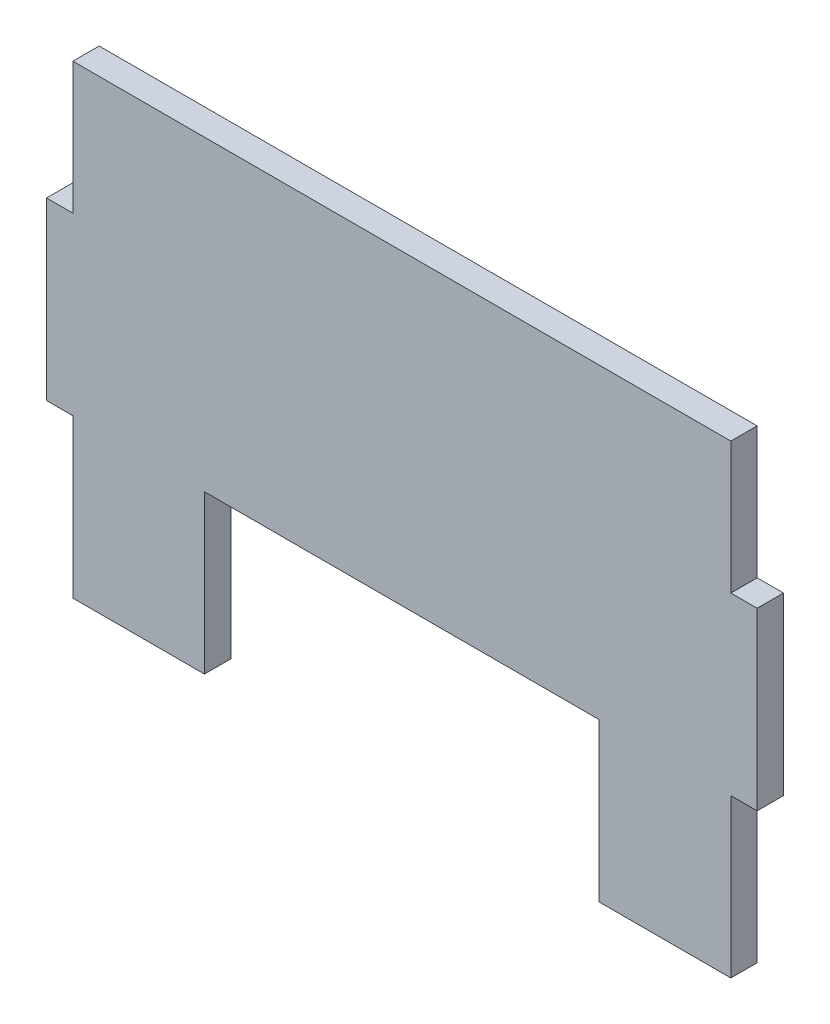
ISO-10303-21;
HEADER;
FILE_DESCRIPTION(('STEP AP214'),'2;1');
FILE_NAME('part.step','',(''),(''),'','','');
FILE_SCHEMA(('AUTOMOTIVE_DESIGN { 1 0 10303 214 1 1 1 1 }'));
ENDSEC;
DATA;
#1=APPLICATION_CONTEXT('core data for automotive mechanical design processes');
#2=APPLICATION_PROTOCOL_DEFINITION('international standard','automotive_design',2000,#1);
#3=PRODUCT_CONTEXT('',#1,'mechanical');
#4=PRODUCT('Part','Part','',(#3));
#5=PRODUCT_RELATED_PRODUCT_CATEGORY('part','',(#4));
#6=PRODUCT_DEFINITION_FORMATION('','',#4);
#7=PRODUCT_DEFINITION_CONTEXT('part definition',#1,'design');
#8=PRODUCT_DEFINITION('design','',#6,#7);
#9=PRODUCT_DEFINITION_SHAPE('','',#8);
#10=(LENGTH_UNIT() NAMED_UNIT(*) SI_UNIT(.MILLI.,.METRE.));
#11=(NAMED_UNIT(*) PLANE_ANGLE_UNIT() SI_UNIT($,.RADIAN.));
#12=(NAMED_UNIT(*) SI_UNIT($,.STERADIAN.) SOLID_ANGLE_UNIT());
#13=UNCERTAINTY_MEASURE_WITH_UNIT(LENGTH_MEASURE(1.E-05),#10,'distance_accuracy_value','');
#14=(GEOMETRIC_REPRESENTATION_CONTEXT(3) GLOBAL_UNCERTAINTY_ASSIGNED_CONTEXT((#13)) GLOBAL_UNIT_ASSIGNED_CONTEXT((#10,
#11,#12)) REPRESENTATION_CONTEXT('',''));
#15=CARTESIAN_POINT('',(0.,0.,0.));
#16=DIRECTION('',(0.,0.,1.));
#17=DIRECTION('',(1.,0.,0.));
#18=AXIS2_PLACEMENT_3D('',#15,#16,#17);
#19=CARTESIAN_POINT('',(-75.,-50.,6.));
#20=DIRECTION('',(1.,0.,0.));
#21=DIRECTION('',(0.,0.,-1.));
#22=AXIS2_PLACEMENT_3D('',#19,#20,#21);
#23=PLANE('',#22);
#24=DIRECTION('',(0.,0.,-1.));
#25=VECTOR('',#24,1.);
#26=CARTESIAN_POINT('',(-75.,20.,0.));
#27=LINE('',#26,#25);
#28=CARTESIAN_POINT('',(-75.,20.,6.));
#29=VERTEX_POINT('',#28);
#30=CARTESIAN_POINT('',(-75.,20.,0.));
#31=VERTEX_POINT('',#30);
#32=EDGE_CURVE('E51',#29,#31,#27,.T.);
#33=ORIENTED_EDGE('',*,*,#32,.F.);
#34=DIRECTION('',(0.,-1.,0.));
#35=VECTOR('',#34,1.);
#36=CARTESIAN_POINT('',(-75.,-50.,6.));
#37=LINE('',#36,#35);
#38=CARTESIAN_POINT('',(-75.,50.,6.));
#39=VERTEX_POINT('',#38);
#40=EDGE_CURVE('E256',#39,#29,#37,.T.);
#41=ORIENTED_EDGE('',*,*,#40,.F.);
#42=DIRECTION('',(0.,0.,-1.));
#43=VECTOR('',#42,1.);
#44=CARTESIAN_POINT('',(-75.,50.,6.));
#45=LINE('',#44,#43);
#46=CARTESIAN_POINT('',(-75.,50.,0.));
#47=VERTEX_POINT('',#46);
#48=EDGE_CURVE('E44',#39,#47,#45,.T.);
#49=ORIENTED_EDGE('',*,*,#48,.T.);
#50=DIRECTION('',(0.,-1.,0.));
#51=VECTOR('',#50,1.);
#52=CARTESIAN_POINT('',(-75.,-50.,0.));
#53=LINE('',#52,#51);
#54=EDGE_CURVE('E264',#47,#31,#53,.T.);
#55=ORIENTED_EDGE('',*,*,#54,.T.);
#56=EDGE_LOOP('',(#33,#41,#49,#55));
#57=FACE_BOUND('',#56,.T.);
#58=ADVANCED_FACE('F37',(#57),#23,.F.);
#59=DIRECTION('',(0.,0.,1.));
#60=VECTOR('',#59,1.);
#61=CARTESIAN_POINT('',(-75.,-20.,0.));
#62=LINE('',#61,#60);
#63=CARTESIAN_POINT('',(-75.,-20.,0.));
#64=VERTEX_POINT('',#63);
#65=CARTESIAN_POINT('',(-75.,-20.,6.));
#66=VERTEX_POINT('',#65);
#67=EDGE_CURVE('E59',#64,#66,#62,.T.);
#68=ORIENTED_EDGE('',*,*,#67,.F.);
#69=CARTESIAN_POINT('',(-75.,-56.,0.));
#70=VERTEX_POINT('',#69);
#71=EDGE_CURVE('E255',#64,#70,#53,.T.);
#72=ORIENTED_EDGE('',*,*,#71,.T.);
#73=DIRECTION('',(0.,0.,-1.));
#74=VECTOR('',#73,1.);
#75=CARTESIAN_POINT('',(-75.,-56.,6.));
#76=LINE('',#75,#74);
#77=CARTESIAN_POINT('',(-75.,-56.,6.));
#78=VERTEX_POINT('',#77);
#79=EDGE_CURVE('E171',#78,#70,#76,.T.);
#80=ORIENTED_EDGE('',*,*,#79,.F.);
#81=EDGE_CURVE('E167',#66,#78,#37,.T.);
#82=ORIENTED_EDGE('',*,*,#81,.F.);
#83=EDGE_LOOP('',(#68,#72,#80,#82));
#84=FACE_BOUND('',#83,.T.);
#85=ADVANCED_FACE('F328',(#84),#23,.F.);
#86=CARTESIAN_POINT('',(75.,-50.,6.));
#87=DIRECTION('',(-1.,0.,0.));
#88=DIRECTION('',(0.,0.,1.));
#89=AXIS2_PLACEMENT_3D('',#86,#87,#88);
#90=PLANE('',#89);
#91=DIRECTION('',(0.,0.,-1.));
#92=VECTOR('',#91,1.);
#93=CARTESIAN_POINT('',(75.,-20.,0.));
#94=LINE('',#93,#92);
#95=CARTESIAN_POINT('',(75.,-20.,6.));
#96=VERTEX_POINT('',#95);
#97=CARTESIAN_POINT('',(75.,-20.,0.));
#98=VERTEX_POINT('',#97);
#99=EDGE_CURVE('E220',#96,#98,#94,.T.);
#100=ORIENTED_EDGE('',*,*,#99,.F.);
#101=DIRECTION('',(0.,1.,0.));
#102=VECTOR('',#101,1.);
#103=CARTESIAN_POINT('',(75.,-50.,6.));
#104=LINE('',#103,#102);
#105=CARTESIAN_POINT('',(75.,-56.,6.));
#106=VERTEX_POINT('',#105);
#107=EDGE_CURVE('E259',#106,#96,#104,.T.);
#108=ORIENTED_EDGE('',*,*,#107,.F.);
#109=DIRECTION('',(0.,0.,1.));
#110=VECTOR('',#109,1.);
#111=CARTESIAN_POINT('',(75.,-56.,6.));
#112=LINE('',#111,#110);
#113=CARTESIAN_POINT('',(75.,-56.,0.));
#114=VERTEX_POINT('',#113);
#115=EDGE_CURVE('E181',#114,#106,#112,.T.);
#116=ORIENTED_EDGE('',*,*,#115,.F.);
#117=DIRECTION('',(0.,1.,0.));
#118=VECTOR('',#117,1.);
#119=CARTESIAN_POINT('',(75.,-50.,0.));
#120=LINE('',#119,#118);
#121=EDGE_CURVE('E267',#114,#98,#120,.T.);
#122=ORIENTED_EDGE('',*,*,#121,.T.);
#123=EDGE_LOOP('',(#100,#108,#116,#122));
#124=FACE_BOUND('',#123,.T.);
#125=ADVANCED_FACE('F306',(#124),#90,.F.);
#126=DIRECTION('',(0.,0.,1.));
#127=VECTOR('',#126,1.);
#128=CARTESIAN_POINT('',(75.,20.,0.));
#129=LINE('',#128,#127);
#130=CARTESIAN_POINT('',(75.,20.,0.));
#131=VERTEX_POINT('',#130);
#132=CARTESIAN_POINT('',(75.,20.,6.));
#133=VERTEX_POINT('',#132);
#134=EDGE_CURVE('E215',#131,#133,#129,.T.);
#135=ORIENTED_EDGE('',*,*,#134,.F.);
#136=CARTESIAN_POINT('',(75.,50.,0.));
#137=VERTEX_POINT('',#136);
#138=EDGE_CURVE('E266',#131,#137,#120,.T.);
#139=ORIENTED_EDGE('',*,*,#138,.T.);
#140=DIRECTION('',(0.,0.,-1.));
#141=VECTOR('',#140,1.);
#142=CARTESIAN_POINT('',(75.,50.,6.));
#143=LINE('',#142,#141);
#144=CARTESIAN_POINT('',(75.,50.,6.));
#145=VERTEX_POINT('',#144);
#146=EDGE_CURVE('E11',#145,#137,#143,.T.);
#147=ORIENTED_EDGE('',*,*,#146,.F.);
#148=EDGE_CURVE('E258',#133,#145,#104,.T.);
#149=ORIENTED_EDGE('',*,*,#148,.F.);
#150=EDGE_LOOP('',(#135,#139,#147,#149));
#151=FACE_BOUND('',#150,.T.);
#152=ADVANCED_FACE('F290',(#151),#90,.F.);
#153=CARTESIAN_POINT('',(75.,50.,6.));
#154=DIRECTION('',(0.,-1.,0.));
#155=DIRECTION('',(1.,0.,0.));
#156=AXIS2_PLACEMENT_3D('',#153,#154,#155);
#157=PLANE('',#156);
#158=DIRECTION('',(-1.,0.,0.));
#159=VECTOR('',#158,1.);
#160=CARTESIAN_POINT('',(75.,50.,0.));
#161=LINE('',#160,#159);
#162=EDGE_CURVE('E269',#137,#47,#161,.T.);
#163=ORIENTED_EDGE('',*,*,#162,.T.);
#164=ORIENTED_EDGE('',*,*,#48,.F.);
#165=DIRECTION('',(-1.,0.,0.));
#166=VECTOR('',#165,1.);
#167=CARTESIAN_POINT('',(75.,50.,6.));
#168=LINE('',#167,#166);
#169=EDGE_CURVE('E262',#145,#39,#168,.T.);
#170=ORIENTED_EDGE('',*,*,#169,.F.);
#171=ORIENTED_EDGE('',*,*,#146,.T.);
#172=EDGE_LOOP('',(#163,#164,#170,#171));
#173=FACE_BOUND('',#172,.T.);
#174=ADVANCED_FACE('F288',(#173),#157,.F.);
#175=CARTESIAN_POINT('',(0.,0.,6.));
#176=DIRECTION('',(0.,0.,1.));
#177=DIRECTION('',(1.,0.,0.));
#178=AXIS2_PLACEMENT_3D('',#175,#176,#177);
#179=PLANE('',#178);
#180=DIRECTION('',(0.,1.,0.));
#181=VECTOR('',#180,1.);
#182=CARTESIAN_POINT('',(45.,-50.,6.));
#183=LINE('',#182,#181);
#184=CARTESIAN_POINT('',(45.,-56.,6.));
#185=VERTEX_POINT('',#184);
#186=CARTESIAN_POINT('',(45.,-20.,6.));
#187=VERTEX_POINT('',#186);
#188=EDGE_CURVE('E161',#185,#187,#183,.T.);
#189=ORIENTED_EDGE('',*,*,#188,.F.);
#190=DIRECTION('',(-1.,0.,0.));
#191=VECTOR('',#190,1.);
#192=CARTESIAN_POINT('',(75.,-56.,6.));
#193=LINE('',#192,#191);
#194=EDGE_CURVE('E184',#106,#185,#193,.T.);
#195=ORIENTED_EDGE('',*,*,#194,.F.);
#196=ORIENTED_EDGE('',*,*,#107,.T.);
#197=DIRECTION('',(-1.,0.,0.));
#198=VECTOR('',#197,1.);
#199=CARTESIAN_POINT('',(81.,-20.,6.));
#200=LINE('',#199,#198);
#201=CARTESIAN_POINT('',(81.,-20.,6.));
#202=VERTEX_POINT('',#201);
#203=EDGE_CURVE('E233',#202,#96,#200,.T.);
#204=ORIENTED_EDGE('',*,*,#203,.F.);
#205=DIRECTION('',(0.,-1.,0.));
#206=VECTOR('',#205,1.);
#207=CARTESIAN_POINT('',(81.,20.,6.));
#208=LINE('',#207,#206);
#209=CARTESIAN_POINT('',(81.,20.,6.));
#210=VERTEX_POINT('',#209);
#211=EDGE_CURVE('E222',#210,#202,#208,.T.);
#212=ORIENTED_EDGE('',*,*,#211,.F.);
#213=DIRECTION('',(-1.,0.,0.));
#214=VECTOR('',#213,1.);
#215=CARTESIAN_POINT('',(81.,20.,6.));
#216=LINE('',#215,#214);
#217=EDGE_CURVE('E236',#210,#133,#216,.T.);
#218=ORIENTED_EDGE('',*,*,#217,.T.);
#219=ORIENTED_EDGE('',*,*,#148,.T.);
#220=ORIENTED_EDGE('',*,*,#169,.T.);
#221=ORIENTED_EDGE('',*,*,#40,.T.);
#222=DIRECTION('',(1.,0.,0.));
#223=VECTOR('',#222,1.);
#224=CARTESIAN_POINT('',(-81.,20.,6.));
#225=LINE('',#224,#223);
#226=CARTESIAN_POINT('',(-81.,20.,6.));
#227=VERTEX_POINT('',#226);
#228=EDGE_CURVE('E207',#227,#29,#225,.T.);
#229=ORIENTED_EDGE('',*,*,#228,.F.);
#230=DIRECTION('',(0.,1.,0.));
#231=VECTOR('',#230,1.);
#232=CARTESIAN_POINT('',(-81.,20.,6.));
#233=LINE('',#232,#231);
#234=CARTESIAN_POINT('',(-81.,-20.,6.));
#235=VERTEX_POINT('',#234);
#236=EDGE_CURVE('E198',#235,#227,#233,.T.);
#237=ORIENTED_EDGE('',*,*,#236,.F.);
#238=DIRECTION('',(1.,0.,0.));
#239=VECTOR('',#238,1.);
#240=CARTESIAN_POINT('',(-81.,-20.,6.));
#241=LINE('',#240,#239);
#242=EDGE_CURVE('E210',#235,#66,#241,.T.);
#243=ORIENTED_EDGE('',*,*,#242,.T.);
#244=ORIENTED_EDGE('',*,*,#81,.T.);
#245=DIRECTION('',(-1.,0.,0.));
#246=VECTOR('',#245,1.);
#247=CARTESIAN_POINT('',(-45.,-56.,6.));
#248=LINE('',#247,#246);
#249=CARTESIAN_POINT('',(-45.,-56.,6.));
#250=VERTEX_POINT('',#249);
#251=EDGE_CURVE('E164',#250,#78,#248,.T.);
#252=ORIENTED_EDGE('',*,*,#251,.F.);
#253=DIRECTION('',(0.,1.,0.));
#254=VECTOR('',#253,1.);
#255=CARTESIAN_POINT('',(-45.,-50.,6.));
#256=LINE('',#255,#254);
#257=CARTESIAN_POINT('',(-45.,-20.,6.));
#258=VERTEX_POINT('',#257);
#259=EDGE_CURVE('E150',#250,#258,#256,.T.);
#260=ORIENTED_EDGE('',*,*,#259,.T.);
#261=DIRECTION('',(1.,0.,0.));
#262=VECTOR('',#261,1.);
#263=CARTESIAN_POINT('',(-45.,-20.,6.));
#264=LINE('',#263,#262);
#265=EDGE_CURVE('E242',#258,#187,#264,.T.);
#266=ORIENTED_EDGE('',*,*,#265,.T.);
#267=EDGE_LOOP('',(#189,#195,#196,#204,#212,#218,#219,#220,#221,#229,#237,#243,#244,#252,#260,#266));
#268=FACE_BOUND('',#267,.T.);
#269=ADVANCED_FACE('F165',(#268),#179,.T.);
#270=CARTESIAN_POINT('',(0.,0.,0.));
#271=DIRECTION('',(0.,0.,1.));
#272=DIRECTION('',(1.,0.,0.));
#273=AXIS2_PLACEMENT_3D('',#270,#271,#272);
#274=PLANE('',#273);
#275=ORIENTED_EDGE('',*,*,#121,.F.);
#276=DIRECTION('',(1.,0.,0.));
#277=VECTOR('',#276,1.);
#278=CARTESIAN_POINT('',(75.,-56.,0.));
#279=LINE('',#278,#277);
#280=CARTESIAN_POINT('',(45.,-56.,0.));
#281=VERTEX_POINT('',#280);
#282=EDGE_CURVE('E190',#281,#114,#279,.T.);
#283=ORIENTED_EDGE('',*,*,#282,.F.);
#284=DIRECTION('',(0.,1.,0.));
#285=VECTOR('',#284,1.);
#286=CARTESIAN_POINT('',(45.,-50.,0.));
#287=LINE('',#286,#285);
#288=CARTESIAN_POINT('',(45.,-20.,0.));
#289=VERTEX_POINT('',#288);
#290=EDGE_CURVE('E244',#281,#289,#287,.T.);
#291=ORIENTED_EDGE('',*,*,#290,.T.);
#292=DIRECTION('',(1.,0.,0.));
#293=VECTOR('',#292,1.);
#294=CARTESIAN_POINT('',(-45.,-20.,0.));
#295=LINE('',#294,#293);
#296=CARTESIAN_POINT('',(-45.,-20.,0.));
#297=VERTEX_POINT('',#296);
#298=EDGE_CURVE('E160',#297,#289,#295,.T.);
#299=ORIENTED_EDGE('',*,*,#298,.F.);
#300=DIRECTION('',(0.,1.,0.));
#301=VECTOR('',#300,1.);
#302=CARTESIAN_POINT('',(-45.,-50.,0.));
#303=LINE('',#302,#301);
#304=CARTESIAN_POINT('',(-45.,-56.,0.));
#305=VERTEX_POINT('',#304);
#306=EDGE_CURVE('E247',#305,#297,#303,.T.);
#307=ORIENTED_EDGE('',*,*,#306,.F.);
#308=DIRECTION('',(1.,0.,0.));
#309=VECTOR('',#308,1.);
#310=CARTESIAN_POINT('',(-45.,-56.,0.));
#311=LINE('',#310,#309);
#312=EDGE_CURVE('E176',#70,#305,#311,.T.);
#313=ORIENTED_EDGE('',*,*,#312,.F.);
#314=ORIENTED_EDGE('',*,*,#71,.F.);
#315=DIRECTION('',(1.,0.,0.));
#316=VECTOR('',#315,1.);
#317=CARTESIAN_POINT('',(-81.,-20.,0.));
#318=LINE('',#317,#316);
#319=CARTESIAN_POINT('',(-81.,-20.,0.));
#320=VERTEX_POINT('',#319);
#321=EDGE_CURVE('E212',#320,#64,#318,.T.);
#322=ORIENTED_EDGE('',*,*,#321,.F.);
#323=DIRECTION('',(0.,-1.,0.));
#324=VECTOR('',#323,1.);
#325=CARTESIAN_POINT('',(-81.,20.,0.));
#326=LINE('',#325,#324);
#327=CARTESIAN_POINT('',(-81.,20.,0.));
#328=VERTEX_POINT('',#327);
#329=EDGE_CURVE('E193',#328,#320,#326,.T.);
#330=ORIENTED_EDGE('',*,*,#329,.F.);
#331=DIRECTION('',(1.,0.,0.));
#332=VECTOR('',#331,1.);
#333=CARTESIAN_POINT('',(-81.,20.,0.));
#334=LINE('',#333,#332);
#335=EDGE_CURVE('E202',#328,#31,#334,.T.);
#336=ORIENTED_EDGE('',*,*,#335,.T.);
#337=ORIENTED_EDGE('',*,*,#54,.F.);
#338=ORIENTED_EDGE('',*,*,#162,.F.);
#339=ORIENTED_EDGE('',*,*,#138,.F.);
#340=DIRECTION('',(-1.,0.,0.));
#341=VECTOR('',#340,1.);
#342=CARTESIAN_POINT('',(81.,20.,0.));
#343=LINE('',#342,#341);
#344=CARTESIAN_POINT('',(81.,20.,0.));
#345=VERTEX_POINT('',#344);
#346=EDGE_CURVE('E239',#345,#131,#343,.T.);
#347=ORIENTED_EDGE('',*,*,#346,.F.);
#348=DIRECTION('',(0.,1.,0.));
#349=VECTOR('',#348,1.);
#350=CARTESIAN_POINT('',(81.,20.,0.));
#351=LINE('',#350,#349);
#352=CARTESIAN_POINT('',(81.,-20.,0.));
#353=VERTEX_POINT('',#352);
#354=EDGE_CURVE('E216',#353,#345,#351,.T.);
#355=ORIENTED_EDGE('',*,*,#354,.F.);
#356=DIRECTION('',(-1.,0.,0.));
#357=VECTOR('',#356,1.);
#358=CARTESIAN_POINT('',(81.,-20.,0.));
#359=LINE('',#358,#357);
#360=EDGE_CURVE('E226',#353,#98,#359,.T.);
#361=ORIENTED_EDGE('',*,*,#360,.T.);
#362=EDGE_LOOP('',(#275,#283,#291,#299,#307,#313,#314,#322,#330,#336,#337,#338,#339,#347,#355,#361));
#363=FACE_BOUND('',#362,.T.);
#364=ADVANCED_FACE('F277',(#363),#274,.F.);
#365=CARTESIAN_POINT('',(-45.,-20.,0.));
#366=DIRECTION('',(0.,-1.,0.));
#367=DIRECTION('',(0.,0.,-1.));
#368=AXIS2_PLACEMENT_3D('',#365,#366,#367);
#369=PLANE('',#368);
#370=ORIENTED_EDGE('',*,*,#265,.F.);
#371=DIRECTION('',(0.,0.,1.));
#372=VECTOR('',#371,1.);
#373=CARTESIAN_POINT('',(-45.,-20.,0.));
#374=LINE('',#373,#372);
#375=EDGE_CURVE('E156',#297,#258,#374,.T.);
#376=ORIENTED_EDGE('',*,*,#375,.F.);
#377=ORIENTED_EDGE('',*,*,#298,.T.);
#378=DIRECTION('',(0.,0.,1.));
#379=VECTOR('',#378,1.);
#380=CARTESIAN_POINT('',(45.,-20.,0.));
#381=LINE('',#380,#379);
#382=EDGE_CURVE('E253',#289,#187,#381,.T.);
#383=ORIENTED_EDGE('',*,*,#382,.T.);
#384=EDGE_LOOP('',(#370,#376,#377,#383));
#385=FACE_BOUND('',#384,.T.);
#386=ADVANCED_FACE('F317',(#385),#369,.T.);
#387=CARTESIAN_POINT('',(45.,-50.,0.));
#388=DIRECTION('',(1.,0.,0.));
#389=DIRECTION('',(0.,0.,-1.));
#390=AXIS2_PLACEMENT_3D('',#387,#388,#389);
#391=PLANE('',#390);
#392=ORIENTED_EDGE('',*,*,#188,.T.);
#393=ORIENTED_EDGE('',*,*,#382,.F.);
#394=ORIENTED_EDGE('',*,*,#290,.F.);
#395=DIRECTION('',(0.,0.,-1.));
#396=VECTOR('',#395,1.);
#397=CARTESIAN_POINT('',(45.,-56.,6.));
#398=LINE('',#397,#396);
#399=EDGE_CURVE('E187',#185,#281,#398,.T.);
#400=ORIENTED_EDGE('',*,*,#399,.F.);
#401=EDGE_LOOP('',(#392,#393,#394,#400));
#402=FACE_BOUND('',#401,.T.);
#403=ADVANCED_FACE('F315',(#402),#391,.F.);
#404=CARTESIAN_POINT('',(-45.,-50.,0.));
#405=DIRECTION('',(1.,0.,0.));
#406=DIRECTION('',(0.,0.,-1.));
#407=AXIS2_PLACEMENT_3D('',#404,#405,#406);
#408=PLANE('',#407);
#409=ORIENTED_EDGE('',*,*,#259,.F.);
#410=DIRECTION('',(0.,0.,1.));
#411=VECTOR('',#410,1.);
#412=CARTESIAN_POINT('',(-45.,-56.,6.));
#413=LINE('',#412,#411);
#414=EDGE_CURVE('E154',#305,#250,#413,.T.);
#415=ORIENTED_EDGE('',*,*,#414,.F.);
#416=ORIENTED_EDGE('',*,*,#306,.T.);
#417=ORIENTED_EDGE('',*,*,#375,.T.);
#418=EDGE_LOOP('',(#409,#415,#416,#417));
#419=FACE_BOUND('',#418,.T.);
#420=ADVANCED_FACE('F152',(#419),#408,.T.);
#421=CARTESIAN_POINT('',(81.,20.,0.));
#422=DIRECTION('',(0.,-1.,0.));
#423=DIRECTION('',(0.,0.,-1.));
#424=AXIS2_PLACEMENT_3D('',#421,#422,#423);
#425=PLANE('',#424);
#426=ORIENTED_EDGE('',*,*,#134,.T.);
#427=ORIENTED_EDGE('',*,*,#217,.F.);
#428=DIRECTION('',(0.,0.,1.));
#429=VECTOR('',#428,1.);
#430=CARTESIAN_POINT('',(81.,20.,0.));
#431=LINE('',#430,#429);
#432=EDGE_CURVE('E219',#345,#210,#431,.T.);
#433=ORIENTED_EDGE('',*,*,#432,.F.);
#434=ORIENTED_EDGE('',*,*,#346,.T.);
#435=EDGE_LOOP('',(#426,#427,#433,#434));
#436=FACE_BOUND('',#435,.T.);
#437=ADVANCED_FACE('F294',(#436),#425,.F.);
#438=CARTESIAN_POINT('',(81.,-20.,0.));
#439=DIRECTION('',(0.,1.,0.));
#440=DIRECTION('',(0.,0.,1.));
#441=AXIS2_PLACEMENT_3D('',#438,#439,#440);
#442=PLANE('',#441);
#443=ORIENTED_EDGE('',*,*,#99,.T.);
#444=ORIENTED_EDGE('',*,*,#360,.F.);
#445=DIRECTION('',(0.,0.,-1.));
#446=VECTOR('',#445,1.);
#447=CARTESIAN_POINT('',(81.,-20.,0.));
#448=LINE('',#447,#446);
#449=EDGE_CURVE('E224',#202,#353,#448,.T.);
#450=ORIENTED_EDGE('',*,*,#449,.F.);
#451=ORIENTED_EDGE('',*,*,#203,.T.);
#452=EDGE_LOOP('',(#443,#444,#450,#451));
#453=FACE_BOUND('',#452,.T.);
#454=ADVANCED_FACE('F303',(#453),#442,.F.);
#455=CARTESIAN_POINT('',(81.,0.,0.));
#456=DIRECTION('',(-1.,0.,0.));
#457=DIRECTION('',(0.,0.,1.));
#458=AXIS2_PLACEMENT_3D('',#455,#456,#457);
#459=PLANE('',#458);
#460=ORIENTED_EDGE('',*,*,#354,.T.);
#461=ORIENTED_EDGE('',*,*,#432,.T.);
#462=ORIENTED_EDGE('',*,*,#211,.T.);
#463=ORIENTED_EDGE('',*,*,#449,.T.);
#464=EDGE_LOOP('',(#460,#461,#462,#463));
#465=FACE_BOUND('',#464,.T.);
#466=ADVANCED_FACE('F298',(#465),#459,.F.);
#467=CARTESIAN_POINT('',(-81.,-20.,0.));
#468=DIRECTION('',(0.,1.,0.));
#469=DIRECTION('',(0.,0.,1.));
#470=AXIS2_PLACEMENT_3D('',#467,#468,#469);
#471=PLANE('',#470);
#472=ORIENTED_EDGE('',*,*,#67,.T.);
#473=ORIENTED_EDGE('',*,*,#242,.F.);
#474=DIRECTION('',(0.,0.,1.));
#475=VECTOR('',#474,1.);
#476=CARTESIAN_POINT('',(-81.,-20.,0.));
#477=LINE('',#476,#475);
#478=EDGE_CURVE('E196',#320,#235,#477,.T.);
#479=ORIENTED_EDGE('',*,*,#478,.F.);
#480=ORIENTED_EDGE('',*,*,#321,.T.);
#481=EDGE_LOOP('',(#472,#473,#479,#480));
#482=FACE_BOUND('',#481,.T.);
#483=ADVANCED_FACE('F391',(#482),#471,.F.);
#484=CARTESIAN_POINT('',(-81.,20.,0.));
#485=DIRECTION('',(0.,-1.,0.));
#486=DIRECTION('',(0.,0.,-1.));
#487=AXIS2_PLACEMENT_3D('',#484,#485,#486);
#488=PLANE('',#487);
#489=ORIENTED_EDGE('',*,*,#32,.T.);
#490=ORIENTED_EDGE('',*,*,#335,.F.);
#491=DIRECTION('',(0.,0.,-1.));
#492=VECTOR('',#491,1.);
#493=CARTESIAN_POINT('',(-81.,20.,0.));
#494=LINE('',#493,#492);
#495=EDGE_CURVE('E200',#227,#328,#494,.T.);
#496=ORIENTED_EDGE('',*,*,#495,.F.);
#497=ORIENTED_EDGE('',*,*,#228,.T.);
#498=EDGE_LOOP('',(#489,#490,#496,#497));
#499=FACE_BOUND('',#498,.T.);
#500=ADVANCED_FACE('F284',(#499),#488,.F.);
#501=CARTESIAN_POINT('',(-81.,0.,0.));
#502=DIRECTION('',(-1.,0.,0.));
#503=DIRECTION('',(0.,0.,1.));
#504=AXIS2_PLACEMENT_3D('',#501,#502,#503);
#505=PLANE('',#504);
#506=ORIENTED_EDGE('',*,*,#329,.T.);
#507=ORIENTED_EDGE('',*,*,#478,.T.);
#508=ORIENTED_EDGE('',*,*,#236,.T.);
#509=ORIENTED_EDGE('',*,*,#495,.T.);
#510=EDGE_LOOP('',(#506,#507,#508,#509));
#511=FACE_BOUND('',#510,.T.);
#512=ADVANCED_FACE('F376',(#511),#505,.T.);
#513=CARTESIAN_POINT('',(0.,-56.,0.));
#514=DIRECTION('',(0.,1.,0.));
#515=DIRECTION('',(-1.,0.,0.));
#516=AXIS2_PLACEMENT_3D('',#513,#514,#515);
#517=PLANE('',#516);
#518=ORIENTED_EDGE('',*,*,#115,.T.);
#519=ORIENTED_EDGE('',*,*,#194,.T.);
#520=ORIENTED_EDGE('',*,*,#399,.T.);
#521=ORIENTED_EDGE('',*,*,#282,.T.);
#522=EDGE_LOOP('',(#518,#519,#520,#521));
#523=FACE_BOUND('',#522,.T.);
#524=ADVANCED_FACE('F311',(#523),#517,.F.);
#525=CARTESIAN_POINT('',(0.,-56.,0.));
#526=DIRECTION('',(0.,1.,0.));
#527=DIRECTION('',(-1.,0.,0.));
#528=AXIS2_PLACEMENT_3D('',#525,#526,#527);
#529=PLANE('',#528);
#530=ORIENTED_EDGE('',*,*,#414,.T.);
#531=ORIENTED_EDGE('',*,*,#251,.T.);
#532=ORIENTED_EDGE('',*,*,#79,.T.);
#533=ORIENTED_EDGE('',*,*,#312,.T.);
#534=EDGE_LOOP('',(#530,#531,#532,#533));
#535=FACE_BOUND('',#534,.T.);
#536=ADVANCED_FACE('F174',(#535),#529,.F.);
#537=CLOSED_SHELL('',(#58,#85,#125,#152,#174,#269,#364,#386,#403,#420,#437,#454,#466,#483,#500,
#512,#524,#536));
#538=MANIFOLD_SOLID_BREP('B2',#537);
#539=ADVANCED_BREP_SHAPE_REPRESENTATION('',(#18,#538),#14);
#540=SHAPE_DEFINITION_REPRESENTATION(#9,#539);
ENDSEC;
END-ISO-10303-21;
